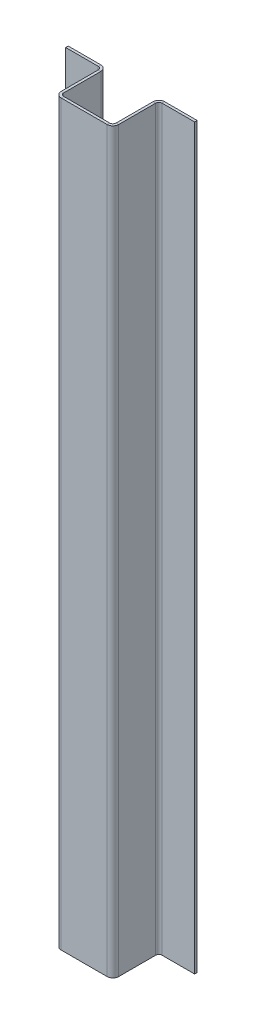
ISO-10303-21;
HEADER;
FILE_DESCRIPTION(('STEP AP214'),'2;1');
FILE_NAME('part.step','',(''),(''),'','','');
FILE_SCHEMA(('AUTOMOTIVE_DESIGN { 1 0 10303 214 1 1 1 1 }'));
ENDSEC;
DATA;
#1=APPLICATION_CONTEXT('core data for automotive mechanical design processes');
#2=APPLICATION_PROTOCOL_DEFINITION('international standard','automotive_design',2000,#1);
#3=PRODUCT_CONTEXT('',#1,'mechanical');
#4=PRODUCT('Part','Part','',(#3));
#5=PRODUCT_RELATED_PRODUCT_CATEGORY('part','',(#4));
#6=PRODUCT_DEFINITION_FORMATION('','',#4);
#7=PRODUCT_DEFINITION_CONTEXT('part definition',#1,'design');
#8=PRODUCT_DEFINITION('design','',#6,#7);
#9=PRODUCT_DEFINITION_SHAPE('','',#8);
#10=(LENGTH_UNIT() NAMED_UNIT(*) SI_UNIT(.MILLI.,.METRE.));
#11=(NAMED_UNIT(*) PLANE_ANGLE_UNIT() SI_UNIT($,.RADIAN.));
#12=(NAMED_UNIT(*) SI_UNIT($,.STERADIAN.) SOLID_ANGLE_UNIT());
#13=UNCERTAINTY_MEASURE_WITH_UNIT(LENGTH_MEASURE(1.E-05),#10,'distance_accuracy_value','');
#14=(GEOMETRIC_REPRESENTATION_CONTEXT(3) GLOBAL_UNCERTAINTY_ASSIGNED_CONTEXT((#13)) GLOBAL_UNIT_ASSIGNED_CONTEXT((#10,
#11,#12)) REPRESENTATION_CONTEXT('',''));
#15=CARTESIAN_POINT('',(0.,0.,0.));
#16=DIRECTION('',(0.,0.,1.));
#17=DIRECTION('',(1.,0.,0.));
#18=AXIS2_PLACEMENT_3D('',#15,#16,#17);
#19=CARTESIAN_POINT('',(22.5000000000006,-289.,-38.0000000000042));
#20=DIRECTION('',(0.,1.,0.));
#21=DIRECTION('',(0.,0.,1.));
#22=AXIS2_PLACEMENT_3D('',#19,#20,#21);
#23=PLANE('',#22);
#24=DIRECTION('',(-1.,0.,0.));
#25=VECTOR('',#24,1.);
#26=CARTESIAN_POINT('',(22.5000000000002,-289.000000000001,-33.5000000000021));
#27=LINE('',#26,#25);
#28=CARTESIAN_POINT('',(22.5000000000002,-289.000000000001,-33.5000000000021));
#29=VERTEX_POINT('',#28);
#30=CARTESIAN_POINT('',(20.5000000000009,-289.000000000001,-33.5000000000019));
#31=VERTEX_POINT('',#30);
#32=EDGE_CURVE('E325',#29,#31,#27,.T.);
#33=ORIENTED_EDGE('',*,*,#32,.F.);
#34=DIRECTION('',(0.,0.,-1.));
#35=VECTOR('',#34,1.);
#36=CARTESIAN_POINT('',(22.5000000000006,-289.,-3.5527136788005E-12));
#37=LINE('',#36,#35);
#38=CARTESIAN_POINT('',(22.5000000000011,-289.000000000002,-4.50000000000284));
#39=VERTEX_POINT('',#38);
#40=EDGE_CURVE('E427',#39,#29,#37,.T.);
#41=ORIENTED_EDGE('',*,*,#40,.F.);
#42=DIRECTION('',(-1.,0.,0.));
#43=VECTOR('',#42,1.);
#44=CARTESIAN_POINT('',(20.5,-289.000000000001,-4.50000000000039));
#45=LINE('',#44,#43);
#46=CARTESIAN_POINT('',(20.5,-289.000000000001,-4.50000000000039));
#47=VERTEX_POINT('',#46);
#48=EDGE_CURVE('E438',#47,#39,#45,.F.);
#49=ORIENTED_EDGE('',*,*,#48,.F.);
#50=DIRECTION('',(0.,0.,1.));
#51=VECTOR('',#50,1.);
#52=CARTESIAN_POINT('',(20.500000000001,-289.,-38.0000000000016));
#53=LINE('',#52,#51);
#54=EDGE_CURVE('E432',#47,#31,#53,.F.);
#55=ORIENTED_EDGE('',*,*,#54,.T.);
#56=EDGE_LOOP('',(#33,#41,#49,#55));
#57=FACE_BOUND('',#56,.T.);
#58=ADVANCED_FACE('F129',(#57),#23,.F.);
#59=CARTESIAN_POINT('',(22.4999999999997,289.000000000001,-1.99999999999978));
#60=DIRECTION('',(0.,-1.,0.));
#61=DIRECTION('',(0.,0.,-1.));
#62=AXIS2_PLACEMENT_3D('',#59,#60,#61);
#63=PLANE('',#62);
#64=DIRECTION('',(-1.,0.,0.));
#65=VECTOR('',#64,1.);
#66=CARTESIAN_POINT('',(22.5,289.,-33.4999999999996));
#67=LINE('',#66,#65);
#68=CARTESIAN_POINT('',(22.5,289.,-33.4999999999996));
#69=VERTEX_POINT('',#68);
#70=CARTESIAN_POINT('',(20.4999999999997,289.,-33.5000000000005));
#71=VERTEX_POINT('',#70);
#72=EDGE_CURVE('E314',#69,#71,#67,.T.);
#73=ORIENTED_EDGE('',*,*,#72,.T.);
#74=DIRECTION('',(0.,0.,-1.));
#75=VECTOR('',#74,1.);
#76=CARTESIAN_POINT('',(20.4999999999996,289.000000000002,-2.00000000000022));
#77=LINE('',#76,#75);
#78=CARTESIAN_POINT('',(20.5000000000006,289.,-4.50000000000017));
#79=VERTEX_POINT('',#78);
#80=EDGE_CURVE('E430',#71,#79,#77,.F.);
#81=ORIENTED_EDGE('',*,*,#80,.T.);
#82=DIRECTION('',(-1.,0.,0.));
#83=VECTOR('',#82,1.);
#84=CARTESIAN_POINT('',(22.5000000000002,289.,-4.50000000000039));
#85=LINE('',#84,#83);
#86=CARTESIAN_POINT('',(22.5000000000002,289.,-4.50000000000039));
#87=VERTEX_POINT('',#86);
#88=EDGE_CURVE('E421',#79,#87,#85,.F.);
#89=ORIENTED_EDGE('',*,*,#88,.T.);
#90=DIRECTION('',(0.,0.,1.));
#91=VECTOR('',#90,1.);
#92=CARTESIAN_POINT('',(22.5000000000001,289.000000000001,-2.22044604925031E-13));
#93=LINE('',#92,#91);
#94=EDGE_CURVE('E424',#69,#87,#93,.T.);
#95=ORIENTED_EDGE('',*,*,#94,.F.);
#96=EDGE_LOOP('',(#73,#81,#89,#95));
#97=FACE_BOUND('',#96,.T.);
#98=ADVANCED_FACE('F523',(#97),#63,.F.);
#99=CARTESIAN_POINT('',(22.5000000000005,-1.66533453693773E-13,-3.5527136788005E-12));
#100=DIRECTION('',(-1.,0.,0.));
#101=DIRECTION('',(0.,0.,1.));
#102=AXIS2_PLACEMENT_3D('',#99,#100,#101);
#103=PLANE('',#102);
#104=DIRECTION('',(0.,1.,0.));
#105=VECTOR('',#104,1.);
#106=CARTESIAN_POINT('',(22.5,289.,-33.4999999999996));
#107=LINE('',#106,#105);
#108=EDGE_CURVE('E320',#69,#29,#107,.F.);
#109=ORIENTED_EDGE('',*,*,#108,.F.);
#110=ORIENTED_EDGE('',*,*,#94,.T.);
#111=DIRECTION('',(0.,-1.,0.));
#112=VECTOR('',#111,1.);
#113=CARTESIAN_POINT('',(22.5000000000002,289.,-4.50000000000039));
#114=LINE('',#113,#112);
#115=EDGE_CURVE('E435',#39,#87,#114,.F.);
#116=ORIENTED_EDGE('',*,*,#115,.F.);
#117=ORIENTED_EDGE('',*,*,#40,.T.);
#118=EDGE_LOOP('',(#109,#110,#116,#117));
#119=FACE_BOUND('',#118,.T.);
#120=ADVANCED_FACE('F529',(#119),#103,.F.);
#121=CARTESIAN_POINT('',(20.5000000000009,-3.88578058618805E-13,-3.33066907387547E-12));
#122=DIRECTION('',(-1.,0.,0.));
#123=DIRECTION('',(0.,0.,1.));
#124=AXIS2_PLACEMENT_3D('',#121,#122,#123);
#125=PLANE('',#124);
#126=ORIENTED_EDGE('',*,*,#80,.F.);
#127=DIRECTION('',(0.,1.,0.));
#128=VECTOR('',#127,1.);
#129=CARTESIAN_POINT('',(20.4999999999997,289.,-33.5000000000005));
#130=LINE('',#129,#128);
#131=EDGE_CURVE('E309',#71,#31,#130,.F.);
#132=ORIENTED_EDGE('',*,*,#131,.T.);
#133=ORIENTED_EDGE('',*,*,#54,.F.);
#134=DIRECTION('',(0.,-1.,0.));
#135=VECTOR('',#134,1.);
#136=CARTESIAN_POINT('',(20.5000000000006,289.,-4.50000000000017));
#137=LINE('',#136,#135);
#138=EDGE_CURVE('E441',#79,#47,#137,.T.);
#139=ORIENTED_EDGE('',*,*,#138,.F.);
#140=EDGE_LOOP('',(#126,#132,#133,#139));
#141=FACE_BOUND('',#140,.T.);
#142=ADVANCED_FACE('F636',(#141),#125,.T.);
#143=CARTESIAN_POINT('',(-22.5000000000001,289.000000000002,-38.0000000000025));
#144=DIRECTION('',(0.,-1.,0.));
#145=DIRECTION('',(0.,0.,-1.));
#146=AXIS2_PLACEMENT_3D('',#143,#144,#145);
#147=PLANE('',#146);
#148=DIRECTION('',(1.,0.,0.));
#149=VECTOR('',#148,1.);
#150=CARTESIAN_POINT('',(-22.5000000000002,289.,-33.5000000000021));
#151=LINE('',#150,#149);
#152=CARTESIAN_POINT('',(-22.5000000000002,289.,-33.5000000000021));
#153=VERTEX_POINT('',#152);
#154=CARTESIAN_POINT('',(-20.5000000000001,289.,-33.5000000000027));
#155=VERTEX_POINT('',#154);
#156=EDGE_CURVE('E375',#153,#155,#151,.T.);
#157=ORIENTED_EDGE('',*,*,#156,.F.);
#158=DIRECTION('',(0.,0.,-1.));
#159=VECTOR('',#158,1.);
#160=CARTESIAN_POINT('',(-22.5000000000001,289.000000000001,-2.22044604925031E-13));
#161=LINE('',#160,#159);
#162=CARTESIAN_POINT('',(-22.4999999999997,289.,-4.50000000000261));
#163=VERTEX_POINT('',#162);
#164=EDGE_CURVE('E383',#163,#153,#161,.T.);
#165=ORIENTED_EDGE('',*,*,#164,.F.);
#166=DIRECTION('',(1.,0.,0.));
#167=VECTOR('',#166,1.);
#168=CARTESIAN_POINT('',(-20.4999999999997,289.,-4.50000000000172));
#169=LINE('',#168,#167);
#170=CARTESIAN_POINT('',(-20.4999999999997,289.,-4.50000000000172));
#171=VERTEX_POINT('',#170);
#172=EDGE_CURVE('E394',#171,#163,#169,.F.);
#173=ORIENTED_EDGE('',*,*,#172,.F.);
#174=DIRECTION('',(0.,0.,1.));
#175=VECTOR('',#174,1.);
#176=CARTESIAN_POINT('',(-20.5000000000001,289.000000000001,-38.0000000000027));
#177=LINE('',#176,#175);
#178=EDGE_CURVE('E388',#171,#155,#177,.F.);
#179=ORIENTED_EDGE('',*,*,#178,.T.);
#180=EDGE_LOOP('',(#157,#165,#173,#179));
#181=FACE_BOUND('',#180,.T.);
#182=ADVANCED_FACE('F503',(#181),#147,.F.);
#183=CARTESIAN_POINT('',(-22.499999999999,-289.,-2.000000000002));
#184=DIRECTION('',(0.,1.,0.));
#185=DIRECTION('',(0.,0.,1.));
#186=AXIS2_PLACEMENT_3D('',#183,#184,#185);
#187=PLANE('',#186);
#188=DIRECTION('',(1.,0.,0.));
#189=VECTOR('',#188,1.);
#190=CARTESIAN_POINT('',(-22.5000000000002,-289.000000000002,-33.5000000000032));
#191=LINE('',#190,#189);
#192=CARTESIAN_POINT('',(-22.5000000000002,-289.000000000002,-33.5000000000032));
#193=VERTEX_POINT('',#192);
#194=CARTESIAN_POINT('',(-20.4999999999996,-289.,-33.5000000000027));
#195=VERTEX_POINT('',#194);
#196=EDGE_CURVE('E365',#193,#195,#191,.T.);
#197=ORIENTED_EDGE('',*,*,#196,.T.);
#198=DIRECTION('',(0.,0.,-1.));
#199=VECTOR('',#198,1.);
#200=CARTESIAN_POINT('',(-20.4999999999996,-289.000000000001,-2.00000000000156));
#201=LINE('',#200,#199);
#202=CARTESIAN_POINT('',(-20.4999999999989,-289.000000000002,-4.50000000000106));
#203=VERTEX_POINT('',#202);
#204=EDGE_CURVE('E386',#195,#203,#201,.F.);
#205=ORIENTED_EDGE('',*,*,#204,.T.);
#206=DIRECTION('',(1.,0.,0.));
#207=VECTOR('',#206,1.);
#208=CARTESIAN_POINT('',(-22.4999999999995,-289.000000000001,-4.5000000000015));
#209=LINE('',#208,#207);
#210=CARTESIAN_POINT('',(-22.4999999999995,-289.000000000001,-4.5000000000015));
#211=VERTEX_POINT('',#210);
#212=EDGE_CURVE('E377',#203,#211,#209,.F.);
#213=ORIENTED_EDGE('',*,*,#212,.T.);
#214=DIRECTION('',(0.,0.,1.));
#215=VECTOR('',#214,1.);
#216=CARTESIAN_POINT('',(-22.4999999999995,-289.000000000001,-2.22044604925031E-12));
#217=LINE('',#216,#215);
#218=EDGE_CURVE('E380',#193,#211,#217,.T.);
#219=ORIENTED_EDGE('',*,*,#218,.F.);
#220=EDGE_LOOP('',(#197,#205,#213,#219));
#221=FACE_BOUND('',#220,.T.);
#222=ADVANCED_FACE('F620',(#221),#187,.F.);
#223=CARTESIAN_POINT('',(-22.4999999999996,-3.33066907387547E-13,-1.77635683940025E-12));
#224=DIRECTION('',(1.,0.,0.));
#225=DIRECTION('',(0.,0.,-1.));
#226=AXIS2_PLACEMENT_3D('',#223,#224,#225);
#227=PLANE('',#226);
#228=DIRECTION('',(0.,-1.,0.));
#229=VECTOR('',#228,1.);
#230=CARTESIAN_POINT('',(-22.5000000000002,-289.000000000002,-33.5000000000032));
#231=LINE('',#230,#229);
#232=EDGE_CURVE('E371',#193,#153,#231,.F.);
#233=ORIENTED_EDGE('',*,*,#232,.F.);
#234=ORIENTED_EDGE('',*,*,#218,.T.);
#235=DIRECTION('',(0.,1.,0.));
#236=VECTOR('',#235,1.);
#237=CARTESIAN_POINT('',(-22.4999999999995,-289.000000000001,-4.5000000000015));
#238=LINE('',#237,#236);
#239=EDGE_CURVE('E391',#163,#211,#238,.F.);
#240=ORIENTED_EDGE('',*,*,#239,.F.);
#241=ORIENTED_EDGE('',*,*,#164,.T.);
#242=EDGE_LOOP('',(#233,#234,#240,#241));
#243=FACE_BOUND('',#242,.T.);
#244=ADVANCED_FACE('F508',(#243),#227,.F.);
#245=CARTESIAN_POINT('',(-20.5,2.22044604925031E-13,0.));
#246=DIRECTION('',(1.,0.,0.));
#247=DIRECTION('',(0.,0.,-1.));
#248=AXIS2_PLACEMENT_3D('',#245,#246,#247);
#249=PLANE('',#248);
#250=ORIENTED_EDGE('',*,*,#204,.F.);
#251=DIRECTION('',(0.,-1.,0.));
#252=VECTOR('',#251,1.);
#253=CARTESIAN_POINT('',(-20.4999999999996,-289.,-33.5000000000027));
#254=LINE('',#253,#252);
#255=EDGE_CURVE('E360',#195,#155,#254,.F.);
#256=ORIENTED_EDGE('',*,*,#255,.T.);
#257=ORIENTED_EDGE('',*,*,#178,.F.);
#258=DIRECTION('',(0.,1.,0.));
#259=VECTOR('',#258,1.);
#260=CARTESIAN_POINT('',(-20.4999999999989,-289.000000000002,-4.50000000000106));
#261=LINE('',#260,#259);
#262=EDGE_CURVE('E397',#203,#171,#261,.T.);
#263=ORIENTED_EDGE('',*,*,#262,.F.);
#264=EDGE_LOOP('',(#250,#256,#257,#263));
#265=FACE_BOUND('',#264,.T.);
#266=ADVANCED_FACE('F500',(#265),#249,.T.);
#267=CARTESIAN_POINT('',(4.44089209850063E-13,3.88578058618805E-13,-2.));
#268=DIRECTION('',(0.,0.,1.));
#269=DIRECTION('',(1.,0.,0.));
#270=AXIS2_PLACEMENT_3D('',#267,#268,#269);
#271=PLANE('',#270);
#272=DIRECTION('',(0.,1.,0.));
#273=VECTOR('',#272,1.);
#274=CARTESIAN_POINT('',(-18.0000000000001,289.000000000002,-2.00000000000133));
#275=LINE('',#274,#273);
#276=CARTESIAN_POINT('',(-18.0000000000001,289.000000000002,-2.00000000000133));
#277=VERTEX_POINT('',#276);
#278=CARTESIAN_POINT('',(-18.0000000000001,-289.000000000001,-2.00000000000156));
#279=VERTEX_POINT('',#278);
#280=EDGE_CURVE('E414',#277,#279,#275,.F.);
#281=ORIENTED_EDGE('',*,*,#280,.F.);
#282=DIRECTION('',(-1.,0.,0.));
#283=VECTOR('',#282,1.);
#284=CARTESIAN_POINT('',(22.4999999999997,289.000000000001,-1.99999999999978));
#285=LINE('',#284,#283);
#286=CARTESIAN_POINT('',(18.0000000000005,289.000000000001,-2.00000000000067));
#287=VERTEX_POINT('',#286);
#288=EDGE_CURVE('E15',#287,#277,#285,.T.);
#289=ORIENTED_EDGE('',*,*,#288,.F.);
#290=DIRECTION('',(0.,-1.,0.));
#291=VECTOR('',#290,1.);
#292=CARTESIAN_POINT('',(18.0000000000003,-289.000000000001,-2.00000000000244));
#293=LINE('',#292,#291);
#294=CARTESIAN_POINT('',(18.0000000000003,-289.000000000001,-2.00000000000244));
#295=VERTEX_POINT('',#294);
#296=EDGE_CURVE('E458',#295,#287,#293,.F.);
#297=ORIENTED_EDGE('',*,*,#296,.F.);
#298=DIRECTION('',(1.,0.,0.));
#299=VECTOR('',#298,1.);
#300=CARTESIAN_POINT('',(22.4999999999996,-288.999999999999,-2.00000000000222));
#301=LINE('',#300,#299);
#302=EDGE_CURVE('E138',#279,#295,#301,.T.);
#303=ORIENTED_EDGE('',*,*,#302,.F.);
#304=EDGE_LOOP('',(#281,#289,#297,#303));
#305=FACE_BOUND('',#304,.T.);
#306=ADVANCED_FACE('F490',(#305),#271,.F.);
#307=CARTESIAN_POINT('',(0.,0.,0.));
#308=DIRECTION('',(0.,0.,1.));
#309=DIRECTION('',(1.,0.,0.));
#310=AXIS2_PLACEMENT_3D('',#307,#308,#309);
#311=PLANE('',#310);
#312=DIRECTION('',(-1.,0.,0.));
#313=VECTOR('',#312,1.);
#314=CARTESIAN_POINT('',(22.5000000000001,289.000000000001,-2.22044604925031E-13));
#315=LINE('',#314,#313);
#316=CARTESIAN_POINT('',(18.0000000000003,289.000000000001,-4.44089209850063E-13));
#317=VERTEX_POINT('',#316);
#318=CARTESIAN_POINT('',(-18.,289.,0.));
#319=VERTEX_POINT('',#318);
#320=EDGE_CURVE('E133',#317,#319,#315,.T.);
#321=ORIENTED_EDGE('',*,*,#320,.T.);
#322=DIRECTION('',(0.,1.,0.));
#323=VECTOR('',#322,1.);
#324=CARTESIAN_POINT('',(-18.,289.,0.));
#325=LINE('',#324,#323);
#326=CARTESIAN_POINT('',(-18.,-289.,0.));
#327=VERTEX_POINT('',#326);
#328=EDGE_CURVE('E401',#319,#327,#325,.F.);
#329=ORIENTED_EDGE('',*,*,#328,.T.);
#330=DIRECTION('',(1.,0.,0.));
#331=VECTOR('',#330,1.);
#332=CARTESIAN_POINT('',(22.5000000000002,-289.,-2.66453525910038E-12));
#333=LINE('',#332,#331);
#334=CARTESIAN_POINT('',(18.0000000000002,-289.000000000001,-3.10862446895044E-12));
#335=VERTEX_POINT('',#334);
#336=EDGE_CURVE('E465',#327,#335,#333,.T.);
#337=ORIENTED_EDGE('',*,*,#336,.T.);
#338=DIRECTION('',(0.,-1.,0.));
#339=VECTOR('',#338,1.);
#340=CARTESIAN_POINT('',(18.0000000000002,-289.000000000001,-3.10862446895044E-12));
#341=LINE('',#340,#339);
#342=EDGE_CURVE('E445',#335,#317,#341,.F.);
#343=ORIENTED_EDGE('',*,*,#342,.T.);
#344=EDGE_LOOP('',(#321,#329,#337,#343));
#345=FACE_BOUND('',#344,.T.);
#346=ADVANCED_FACE('F474',(#345),#311,.T.);
#347=CARTESIAN_POINT('',(22.4999999999997,289.000000000001,-1.99999999999978));
#348=DIRECTION('',(0.,1.,0.));
#349=DIRECTION('',(0.,0.,1.));
#350=AXIS2_PLACEMENT_3D('',#347,#348,#349);
#351=PLANE('',#350);
#352=ORIENTED_EDGE('',*,*,#288,.T.);
#353=DIRECTION('',(0.,0.,1.));
#354=VECTOR('',#353,1.);
#355=CARTESIAN_POINT('',(-18.0000000000001,289.000000000002,-2.00000000000133));
#356=LINE('',#355,#354);
#357=EDGE_CURVE('E408',#277,#319,#356,.T.);
#358=ORIENTED_EDGE('',*,*,#357,.T.);
#359=ORIENTED_EDGE('',*,*,#320,.F.);
#360=DIRECTION('',(0.,0.,1.));
#361=VECTOR('',#360,1.);
#362=CARTESIAN_POINT('',(18.0000000000005,289.000000000001,-2.00000000000067));
#363=LINE('',#362,#361);
#364=EDGE_CURVE('E462',#287,#317,#363,.T.);
#365=ORIENTED_EDGE('',*,*,#364,.F.);
#366=EDGE_LOOP('',(#352,#358,#359,#365));
#367=FACE_BOUND('',#366,.T.);
#368=ADVANCED_FACE('F477',(#367),#351,.T.);
#369=CARTESIAN_POINT('',(22.4999999999996,-288.999999999999,-2.00000000000222));
#370=DIRECTION('',(0.,-1.,0.));
#371=DIRECTION('',(0.,0.,-1.));
#372=AXIS2_PLACEMENT_3D('',#369,#370,#371);
#373=PLANE('',#372);
#374=DIRECTION('',(0.,0.,1.));
#375=VECTOR('',#374,1.);
#376=CARTESIAN_POINT('',(-18.0000000000001,-289.000000000001,-2.00000000000156));
#377=LINE('',#376,#375);
#378=EDGE_CURVE('E418',#279,#327,#377,.T.);
#379=ORIENTED_EDGE('',*,*,#378,.F.);
#380=ORIENTED_EDGE('',*,*,#302,.T.);
#381=DIRECTION('',(0.,0.,1.));
#382=VECTOR('',#381,1.);
#383=CARTESIAN_POINT('',(18.0000000000003,-289.000000000001,-2.00000000000244));
#384=LINE('',#383,#382);
#385=EDGE_CURVE('E452',#295,#335,#384,.T.);
#386=ORIENTED_EDGE('',*,*,#385,.T.);
#387=ORIENTED_EDGE('',*,*,#336,.F.);
#388=EDGE_LOOP('',(#379,#380,#386,#387));
#389=FACE_BOUND('',#388,.T.);
#390=ADVANCED_FACE('F131',(#389),#373,.T.);
#391=CARTESIAN_POINT('',(18.0000000000005,289.,-4.50000000000017));
#392=DIRECTION('',(0.,1.,0.));
#393=DIRECTION('',(0.,0.,1.));
#394=AXIS2_PLACEMENT_3D('',#391,#392,#393);
#395=PLANE('',#394);
#396=ORIENTED_EDGE('',*,*,#88,.F.);
#397=CARTESIAN_POINT('',(18.0000000000005,289.,-4.50000000000017));
#398=DIRECTION('',(0.,-1.,0.));
#399=DIRECTION('',(0.,0.,-1.));
#400=AXIS2_PLACEMENT_3D('',#397,#398,#399);
#401=CIRCLE('',#400,2.5);
#402=EDGE_CURVE('E455',#287,#79,#401,.F.);
#403=ORIENTED_EDGE('',*,*,#402,.F.);
#404=ORIENTED_EDGE('',*,*,#364,.T.);
#405=CARTESIAN_POINT('',(18.0000000000005,289.,-4.50000000000017));
#406=DIRECTION('',(0.,-1.,0.));
#407=DIRECTION('',(0.,0.,-1.));
#408=AXIS2_PLACEMENT_3D('',#405,#406,#407);
#409=CIRCLE('',#408,4.5);
#410=EDGE_CURVE('E448',#317,#87,#409,.F.);
#411=ORIENTED_EDGE('',*,*,#410,.T.);
#412=EDGE_LOOP('',(#396,#403,#404,#411));
#413=FACE_BOUND('',#412,.T.);
#414=ADVANCED_FACE('F544',(#413),#395,.T.);
#415=CARTESIAN_POINT('',(18.0000000000006,-289.000000000002,-4.50000000000239));
#416=DIRECTION('',(0.,1.,0.));
#417=DIRECTION('',(0.,0.,1.));
#418=AXIS2_PLACEMENT_3D('',#415,#416,#417);
#419=PLANE('',#418);
#420=CARTESIAN_POINT('',(18.0000000000006,-289.000000000002,-4.50000000000239));
#421=DIRECTION('',(0.,-1.,0.));
#422=DIRECTION('',(0.,0.,-1.));
#423=AXIS2_PLACEMENT_3D('',#420,#421,#422);
#424=CIRCLE('',#423,2.5);
#425=EDGE_CURVE('E426',#47,#295,#424,.T.);
#426=ORIENTED_EDGE('',*,*,#425,.F.);
#427=ORIENTED_EDGE('',*,*,#48,.T.);
#428=CARTESIAN_POINT('',(18.0000000000006,-289.000000000002,-4.50000000000239));
#429=DIRECTION('',(0.,-1.,0.));
#430=DIRECTION('',(0.,0.,-1.));
#431=AXIS2_PLACEMENT_3D('',#428,#429,#430);
#432=CIRCLE('',#431,4.5);
#433=EDGE_CURVE('E449',#39,#335,#432,.T.);
#434=ORIENTED_EDGE('',*,*,#433,.T.);
#435=ORIENTED_EDGE('',*,*,#385,.F.);
#436=EDGE_LOOP('',(#426,#427,#434,#435));
#437=FACE_BOUND('',#436,.T.);
#438=ADVANCED_FACE('F539',(#437),#419,.F.);
#439=CARTESIAN_POINT('',(18.0000000000006,-289.000000000002,-4.50000000000239));
#440=DIRECTION('',(0.,-1.,0.));
#441=DIRECTION('',(1.,0.,0.));
#442=AXIS2_PLACEMENT_3D('',#439,#440,#441);
#443=CYLINDRICAL_SURFACE('',#442,4.5);
#444=ORIENTED_EDGE('',*,*,#342,.F.);
#445=ORIENTED_EDGE('',*,*,#433,.F.);
#446=ORIENTED_EDGE('',*,*,#115,.T.);
#447=ORIENTED_EDGE('',*,*,#410,.F.);
#448=EDGE_LOOP('',(#444,#445,#446,#447));
#449=FACE_BOUND('',#448,.T.);
#450=ADVANCED_FACE('F535',(#449),#443,.T.);
#451=CARTESIAN_POINT('',(18.0000000000006,-289.000000000002,-4.50000000000239));
#452=DIRECTION('',(0.,-1.,0.));
#453=DIRECTION('',(1.,0.,0.));
#454=AXIS2_PLACEMENT_3D('',#451,#452,#453);
#455=CYLINDRICAL_SURFACE('',#454,2.5);
#456=ORIENTED_EDGE('',*,*,#296,.T.);
#457=ORIENTED_EDGE('',*,*,#402,.T.);
#458=ORIENTED_EDGE('',*,*,#138,.T.);
#459=ORIENTED_EDGE('',*,*,#425,.T.);
#460=EDGE_LOOP('',(#456,#457,#458,#459));
#461=FACE_BOUND('',#460,.T.);
#462=ADVANCED_FACE('F538',(#461),#455,.F.);
#463=CARTESIAN_POINT('',(-17.9999999999989,-289.000000000001,-4.5000000000015));
#464=DIRECTION('',(0.,-1.,0.));
#465=DIRECTION('',(0.,0.,-1.));
#466=AXIS2_PLACEMENT_3D('',#463,#464,#465);
#467=PLANE('',#466);
#468=ORIENTED_EDGE('',*,*,#212,.F.);
#469=CARTESIAN_POINT('',(-17.9999999999989,-289.000000000001,-4.5000000000015));
#470=DIRECTION('',(0.,1.,0.));
#471=DIRECTION('',(0.,0.,1.));
#472=AXIS2_PLACEMENT_3D('',#469,#470,#471);
#473=CIRCLE('',#472,2.5);
#474=EDGE_CURVE('E411',#279,#203,#473,.F.);
#475=ORIENTED_EDGE('',*,*,#474,.F.);
#476=ORIENTED_EDGE('',*,*,#378,.T.);
#477=CARTESIAN_POINT('',(-17.9999999999989,-289.000000000001,-4.5000000000015));
#478=DIRECTION('',(0.,1.,0.));
#479=DIRECTION('',(0.,0.,1.));
#480=AXIS2_PLACEMENT_3D('',#477,#478,#479);
#481=CIRCLE('',#480,4.5);
#482=EDGE_CURVE('E404',#327,#211,#481,.F.);
#483=ORIENTED_EDGE('',*,*,#482,.T.);
#484=EDGE_LOOP('',(#468,#475,#476,#483));
#485=FACE_BOUND('',#484,.T.);
#486=ADVANCED_FACE('F496',(#485),#467,.T.);
#487=CARTESIAN_POINT('',(-17.9999999999997,289.,-4.50000000000017));
#488=DIRECTION('',(0.,-1.,0.));
#489=DIRECTION('',(0.,0.,-1.));
#490=AXIS2_PLACEMENT_3D('',#487,#488,#489);
#491=PLANE('',#490);
#492=CARTESIAN_POINT('',(-17.9999999999997,289.,-4.50000000000017));
#493=DIRECTION('',(0.,1.,0.));
#494=DIRECTION('',(0.,0.,1.));
#495=AXIS2_PLACEMENT_3D('',#492,#493,#494);
#496=CIRCLE('',#495,2.5);
#497=EDGE_CURVE('E382',#171,#277,#496,.T.);
#498=ORIENTED_EDGE('',*,*,#497,.F.);
#499=ORIENTED_EDGE('',*,*,#172,.T.);
#500=CARTESIAN_POINT('',(-17.9999999999997,289.,-4.50000000000017));
#501=DIRECTION('',(0.,1.,0.));
#502=DIRECTION('',(0.,0.,1.));
#503=AXIS2_PLACEMENT_3D('',#500,#501,#502);
#504=CIRCLE('',#503,4.5);
#505=EDGE_CURVE('E405',#163,#319,#504,.T.);
#506=ORIENTED_EDGE('',*,*,#505,.T.);
#507=ORIENTED_EDGE('',*,*,#357,.F.);
#508=EDGE_LOOP('',(#498,#499,#506,#507));
#509=FACE_BOUND('',#508,.T.);
#510=ADVANCED_FACE('F481',(#509),#491,.F.);
#511=CARTESIAN_POINT('',(-17.9999999999997,289.,-4.50000000000017));
#512=DIRECTION('',(0.,1.,0.));
#513=DIRECTION('',(-1.,0.,0.));
#514=AXIS2_PLACEMENT_3D('',#511,#512,#513);
#515=CYLINDRICAL_SURFACE('',#514,4.5);
#516=ORIENTED_EDGE('',*,*,#328,.F.);
#517=ORIENTED_EDGE('',*,*,#505,.F.);
#518=ORIENTED_EDGE('',*,*,#239,.T.);
#519=ORIENTED_EDGE('',*,*,#482,.F.);
#520=EDGE_LOOP('',(#516,#517,#518,#519));
#521=FACE_BOUND('',#520,.T.);
#522=ADVANCED_FACE('F511',(#521),#515,.T.);
#523=CARTESIAN_POINT('',(-17.9999999999997,289.,-4.50000000000017));
#524=DIRECTION('',(0.,1.,0.));
#525=DIRECTION('',(-1.,0.,0.));
#526=AXIS2_PLACEMENT_3D('',#523,#524,#525);
#527=CYLINDRICAL_SURFACE('',#526,2.5);
#528=ORIENTED_EDGE('',*,*,#280,.T.);
#529=ORIENTED_EDGE('',*,*,#474,.T.);
#530=ORIENTED_EDGE('',*,*,#262,.T.);
#531=ORIENTED_EDGE('',*,*,#497,.T.);
#532=EDGE_LOOP('',(#528,#529,#530,#531));
#533=FACE_BOUND('',#532,.T.);
#534=ADVANCED_FACE('F485',(#533),#527,.F.);
#535=CARTESIAN_POINT('',(-24.9999999999998,289.,-33.5000000000005));
#536=DIRECTION('',(0.,1.,0.));
#537=DIRECTION('',(0.,0.,1.));
#538=AXIS2_PLACEMENT_3D('',#535,#536,#537);
#539=PLANE('',#538);
#540=DIRECTION('',(0.,0.,1.));
#541=VECTOR('',#540,1.);
#542=CARTESIAN_POINT('',(-25.0000000000002,289.000000000002,-38.0000000000007));
#543=LINE('',#542,#541);
#544=CARTESIAN_POINT('',(-25.0000000000007,289.000000000001,-36.0000000000023));
#545=VERTEX_POINT('',#544);
#546=CARTESIAN_POINT('',(-25.0000000000002,289.000000000002,-38.0000000000007));
#547=VERTEX_POINT('',#546);
#548=EDGE_CURVE('E327',#545,#547,#543,.F.);
#549=ORIENTED_EDGE('',*,*,#548,.F.);
#550=CARTESIAN_POINT('',(-24.9999999999998,289.,-33.5000000000005));
#551=DIRECTION('',(0.,-1.,0.));
#552=DIRECTION('',(0.,0.,-1.));
#553=AXIS2_PLACEMENT_3D('',#550,#551,#552);
#554=CIRCLE('',#553,2.50000000000001);
#555=EDGE_CURVE('E368',#153,#545,#554,.F.);
#556=ORIENTED_EDGE('',*,*,#555,.F.);
#557=ORIENTED_EDGE('',*,*,#156,.T.);
#558=CARTESIAN_POINT('',(-24.9999999999998,289.,-33.5000000000005));
#559=DIRECTION('',(0.,-1.,0.));
#560=DIRECTION('',(0.,0.,-1.));
#561=AXIS2_PLACEMENT_3D('',#558,#559,#560);
#562=CIRCLE('',#561,4.50000000000001);
#563=EDGE_CURVE('E154',#155,#547,#562,.F.);
#564=ORIENTED_EDGE('',*,*,#563,.T.);
#565=EDGE_LOOP('',(#549,#556,#557,#564));
#566=FACE_BOUND('',#565,.T.);
#567=ADVANCED_FACE('F518',(#566),#539,.T.);
#568=CARTESIAN_POINT('',(-24.9999999999997,-289.,-33.5000000000023));
#569=DIRECTION('',(0.,1.,0.));
#570=DIRECTION('',(0.,0.,1.));
#571=AXIS2_PLACEMENT_3D('',#568,#569,#570);
#572=PLANE('',#571);
#573=CARTESIAN_POINT('',(-24.9999999999997,-289.,-33.5000000000023));
#574=DIRECTION('',(0.,-1.,0.));
#575=DIRECTION('',(0.,0.,-1.));
#576=AXIS2_PLACEMENT_3D('',#573,#574,#575);
#577=CIRCLE('',#576,2.50000000000001);
#578=CARTESIAN_POINT('',(-24.9999999999998,-289.000000000001,-36.0000000000027));
#579=VERTEX_POINT('',#578);
#580=EDGE_CURVE('E333',#579,#193,#577,.T.);
#581=ORIENTED_EDGE('',*,*,#580,.F.);
#582=DIRECTION('',(0.,0.,1.));
#583=VECTOR('',#582,1.);
#584=CARTESIAN_POINT('',(-24.9999999999998,-289.000000000001,-36.0000000000027));
#585=LINE('',#584,#583);
#586=CARTESIAN_POINT('',(-24.9999999999992,-289.,-38.0000000000034));
#587=VERTEX_POINT('',#586);
#588=EDGE_CURVE('E353',#579,#587,#585,.F.);
#589=ORIENTED_EDGE('',*,*,#588,.T.);
#590=CARTESIAN_POINT('',(-24.9999999999997,-289.,-33.5000000000023));
#591=DIRECTION('',(0.,-1.,0.));
#592=DIRECTION('',(0.,0.,-1.));
#593=AXIS2_PLACEMENT_3D('',#590,#591,#592);
#594=CIRCLE('',#593,4.50000000000001);
#595=EDGE_CURVE('E363',#587,#195,#594,.T.);
#596=ORIENTED_EDGE('',*,*,#595,.T.);
#597=ORIENTED_EDGE('',*,*,#196,.F.);
#598=EDGE_LOOP('',(#581,#589,#596,#597));
#599=FACE_BOUND('',#598,.T.);
#600=ADVANCED_FACE('F666',(#599),#572,.F.);
#601=CARTESIAN_POINT('',(-24.9999999999997,-289.,-33.5000000000023));
#602=DIRECTION('',(0.,-1.,0.));
#603=DIRECTION('',(0.,0.,-1.));
#604=AXIS2_PLACEMENT_3D('',#601,#602,#603);
#605=CYLINDRICAL_SURFACE('',#604,4.50000000000001);
#606=ORIENTED_EDGE('',*,*,#255,.F.);
#607=ORIENTED_EDGE('',*,*,#595,.F.);
#608=DIRECTION('',(0.,-1.,0.));
#609=VECTOR('',#608,1.);
#610=CARTESIAN_POINT('',(-25.0000000000002,289.000000000002,-38.0000000000007));
#611=LINE('',#610,#609);
#612=EDGE_CURVE('E351',#587,#547,#611,.F.);
#613=ORIENTED_EDGE('',*,*,#612,.T.);
#614=ORIENTED_EDGE('',*,*,#563,.F.);
#615=EDGE_LOOP('',(#606,#607,#613,#614));
#616=FACE_BOUND('',#615,.T.);
#617=ADVANCED_FACE('F676',(#616),#605,.T.);
#618=CARTESIAN_POINT('',(-24.9999999999997,-289.,-33.5000000000023));
#619=DIRECTION('',(0.,-1.,0.));
#620=DIRECTION('',(0.,0.,-1.));
#621=AXIS2_PLACEMENT_3D('',#618,#619,#620);
#622=CYLINDRICAL_SURFACE('',#621,2.50000000000001);
#623=ORIENTED_EDGE('',*,*,#232,.T.);
#624=ORIENTED_EDGE('',*,*,#555,.T.);
#625=DIRECTION('',(0.,-1.,0.));
#626=VECTOR('',#625,1.);
#627=CARTESIAN_POINT('',(-25.0000000000007,289.000000000001,-36.0000000000023));
#628=LINE('',#627,#626);
#629=EDGE_CURVE('E356',#545,#579,#628,.T.);
#630=ORIENTED_EDGE('',*,*,#629,.T.);
#631=ORIENTED_EDGE('',*,*,#580,.T.);
#632=EDGE_LOOP('',(#623,#624,#630,#631));
#633=FACE_BOUND('',#632,.T.);
#634=ADVANCED_FACE('F686',(#633),#622,.F.);
#635=CARTESIAN_POINT('',(-50.4999999999998,-289.,-38.0000000000014));
#636=DIRECTION('',(0.,1.,0.));
#637=DIRECTION('',(0.,0.,1.));
#638=AXIS2_PLACEMENT_3D('',#635,#636,#637);
#639=PLANE('',#638);
#640=ORIENTED_EDGE('',*,*,#588,.F.);
#641=DIRECTION('',(1.,0.,0.));
#642=VECTOR('',#641,1.);
#643=CARTESIAN_POINT('',(-50.4999999999992,-289.000000000001,-36.0000000000023));
#644=LINE('',#643,#642);
#645=CARTESIAN_POINT('',(-50.4999999999992,-289.000000000001,-36.0000000000023));
#646=VERTEX_POINT('',#645);
#647=EDGE_CURVE('E349',#579,#646,#644,.F.);
#648=ORIENTED_EDGE('',*,*,#647,.T.);
#649=DIRECTION('',(0.,0.,1.));
#650=VECTOR('',#649,1.);
#651=CARTESIAN_POINT('',(-50.4999999999998,-289.,-38.0000000000014));
#652=LINE('',#651,#650);
#653=CARTESIAN_POINT('',(-50.4999999999998,-289.,-38.0000000000014));
#654=VERTEX_POINT('',#653);
#655=EDGE_CURVE('E330',#654,#646,#652,.T.);
#656=ORIENTED_EDGE('',*,*,#655,.F.);
#657=DIRECTION('',(-1.,0.,0.));
#658=VECTOR('',#657,1.);
#659=CARTESIAN_POINT('',(2.22044604925031E-13,-289.000000000001,-38.0000000000018));
#660=LINE('',#659,#658);
#661=EDGE_CURVE('E342',#587,#654,#660,.T.);
#662=ORIENTED_EDGE('',*,*,#661,.F.);
#663=EDGE_LOOP('',(#640,#648,#656,#662));
#664=FACE_BOUND('',#663,.T.);
#665=ADVANCED_FACE('F695',(#664),#639,.F.);
#666=CARTESIAN_POINT('',(-22.5000000000001,289.000000000002,-38.0000000000025));
#667=DIRECTION('',(0.,-1.,0.));
#668=DIRECTION('',(0.,0.,-1.));
#669=AXIS2_PLACEMENT_3D('',#666,#667,#668);
#670=PLANE('',#669);
#671=ORIENTED_EDGE('',*,*,#548,.T.);
#672=DIRECTION('',(1.,0.,0.));
#673=VECTOR('',#672,1.);
#674=CARTESIAN_POINT('',(2.22044604925031E-13,289.000000000002,-38.0000000000018));
#675=LINE('',#674,#673);
#676=CARTESIAN_POINT('',(-50.5000000000002,289.000000000001,-37.9999999999998));
#677=VERTEX_POINT('',#676);
#678=EDGE_CURVE('E337',#677,#547,#675,.T.);
#679=ORIENTED_EDGE('',*,*,#678,.F.);
#680=DIRECTION('',(0.,0.,1.));
#681=VECTOR('',#680,1.);
#682=CARTESIAN_POINT('',(-50.5000000000002,289.000000000001,-37.9999999999998));
#683=LINE('',#682,#681);
#684=CARTESIAN_POINT('',(-50.5000000000002,289.000000000001,-36.0000000000023));
#685=VERTEX_POINT('',#684);
#686=EDGE_CURVE('E334',#677,#685,#683,.T.);
#687=ORIENTED_EDGE('',*,*,#686,.T.);
#688=DIRECTION('',(-1.,0.,0.));
#689=VECTOR('',#688,1.);
#690=CARTESIAN_POINT('',(-22.5000000000002,289.000000000001,-36.0000000000003));
#691=LINE('',#690,#689);
#692=EDGE_CURVE('E344',#685,#545,#691,.F.);
#693=ORIENTED_EDGE('',*,*,#692,.T.);
#694=EDGE_LOOP('',(#671,#679,#687,#693));
#695=FACE_BOUND('',#694,.T.);
#696=ADVANCED_FACE('F705',(#695),#670,.F.);
#697=CARTESIAN_POINT('',(0.,-6.10622663543836E-13,-38.0000000000005));
#698=DIRECTION('',(0.,0.,1.));
#699=DIRECTION('',(1.,0.,0.));
#700=AXIS2_PLACEMENT_3D('',#697,#698,#699);
#701=PLANE('',#700);
#702=ORIENTED_EDGE('',*,*,#612,.F.);
#703=ORIENTED_EDGE('',*,*,#661,.T.);
#704=DIRECTION('',(0.,1.,0.));
#705=VECTOR('',#704,1.);
#706=CARTESIAN_POINT('',(-50.4999999999994,-4.44089209850063E-13,-38.000000000002));
#707=LINE('',#706,#705);
#708=EDGE_CURVE('E340',#654,#677,#707,.T.);
#709=ORIENTED_EDGE('',*,*,#708,.T.);
#710=ORIENTED_EDGE('',*,*,#678,.T.);
#711=EDGE_LOOP('',(#702,#703,#709,#710));
#712=FACE_BOUND('',#711,.T.);
#713=ADVANCED_FACE('F715',(#712),#701,.F.);
#714=CARTESIAN_POINT('',(4.9960036108132E-13,-6.10622663543836E-13,-36.0000000000023));
#715=DIRECTION('',(0.,0.,1.));
#716=DIRECTION('',(1.,0.,0.));
#717=AXIS2_PLACEMENT_3D('',#714,#715,#716);
#718=PLANE('',#717);
#719=ORIENTED_EDGE('',*,*,#647,.F.);
#720=ORIENTED_EDGE('',*,*,#629,.F.);
#721=ORIENTED_EDGE('',*,*,#692,.F.);
#722=DIRECTION('',(0.,-1.,0.));
#723=VECTOR('',#722,1.);
#724=CARTESIAN_POINT('',(-50.5000000000002,289.000000000001,-36.0000000000023));
#725=LINE('',#724,#723);
#726=EDGE_CURVE('E347',#646,#685,#725,.F.);
#727=ORIENTED_EDGE('',*,*,#726,.F.);
#728=EDGE_LOOP('',(#719,#720,#721,#727));
#729=FACE_BOUND('',#728,.T.);
#730=ADVANCED_FACE('F725',(#729),#718,.T.);
#731=CARTESIAN_POINT('',(-50.5000000000002,289.000000000001,-37.9999999999998));
#732=DIRECTION('',(1.,0.,0.));
#733=DIRECTION('',(0.,0.,-1.));
#734=AXIS2_PLACEMENT_3D('',#731,#732,#733);
#735=PLANE('',#734);
#736=ORIENTED_EDGE('',*,*,#726,.T.);
#737=ORIENTED_EDGE('',*,*,#686,.F.);
#738=ORIENTED_EDGE('',*,*,#708,.F.);
#739=ORIENTED_EDGE('',*,*,#655,.T.);
#740=EDGE_LOOP('',(#736,#737,#738,#739));
#741=FACE_BOUND('',#740,.T.);
#742=ADVANCED_FACE('F735',(#741),#735,.F.);
#743=CARTESIAN_POINT('',(25.0000000000001,-289.000000000001,-33.5000000000025));
#744=DIRECTION('',(0.,-1.,0.));
#745=DIRECTION('',(0.,0.,-1.));
#746=AXIS2_PLACEMENT_3D('',#743,#744,#745);
#747=PLANE('',#746);
#748=DIRECTION('',(0.,0.,1.));
#749=VECTOR('',#748,1.);
#750=CARTESIAN_POINT('',(25.000000000001,-289.000000000001,-38.0000000000031));
#751=LINE('',#750,#749);
#752=CARTESIAN_POINT('',(25.000000000001,-289.,-36.0000000000027));
#753=VERTEX_POINT('',#752);
#754=CARTESIAN_POINT('',(25.000000000001,-289.000000000001,-38.0000000000031));
#755=VERTEX_POINT('',#754);
#756=EDGE_CURVE('E292',#753,#755,#751,.F.);
#757=ORIENTED_EDGE('',*,*,#756,.F.);
#758=CARTESIAN_POINT('',(25.0000000000001,-289.000000000001,-33.5000000000025));
#759=DIRECTION('',(0.,1.,0.));
#760=DIRECTION('',(0.,0.,1.));
#761=AXIS2_PLACEMENT_3D('',#758,#759,#760);
#762=CIRCLE('',#761,2.50000000000001);
#763=EDGE_CURVE('E317',#29,#753,#762,.F.);
#764=ORIENTED_EDGE('',*,*,#763,.F.);
#765=ORIENTED_EDGE('',*,*,#32,.T.);
#766=CARTESIAN_POINT('',(25.0000000000001,-289.000000000001,-33.5000000000025));
#767=DIRECTION('',(0.,1.,0.));
#768=DIRECTION('',(0.,0.,1.));
#769=AXIS2_PLACEMENT_3D('',#766,#767,#768);
#770=CIRCLE('',#769,4.50000000000001);
#771=EDGE_CURVE('E146',#31,#755,#770,.F.);
#772=ORIENTED_EDGE('',*,*,#771,.T.);
#773=EDGE_LOOP('',(#757,#764,#765,#772));
#774=FACE_BOUND('',#773,.T.);
#775=ADVANCED_FACE('F745',(#774),#747,.T.);
#776=CARTESIAN_POINT('',(24.9999999999999,289.,-33.5000000000005));
#777=DIRECTION('',(0.,-1.,0.));
#778=DIRECTION('',(0.,0.,-1.));
#779=AXIS2_PLACEMENT_3D('',#776,#777,#778);
#780=PLANE('',#779);
#781=CARTESIAN_POINT('',(24.9999999999999,289.,-33.5000000000005));
#782=DIRECTION('',(0.,1.,0.));
#783=DIRECTION('',(0.,0.,1.));
#784=AXIS2_PLACEMENT_3D('',#781,#782,#783);
#785=CIRCLE('',#784,2.50000000000001);
#786=CARTESIAN_POINT('',(25.0000000000006,289.000000000002,-36.0000000000007));
#787=VERTEX_POINT('',#786);
#788=EDGE_CURVE('E322',#787,#69,#785,.T.);
#789=ORIENTED_EDGE('',*,*,#788,.F.);
#790=DIRECTION('',(0.,0.,1.));
#791=VECTOR('',#790,1.);
#792=CARTESIAN_POINT('',(25.0000000000006,289.000000000002,-36.0000000000007));
#793=LINE('',#792,#791);
#794=CARTESIAN_POINT('',(25.0000000000001,289.000000000001,-38.0000000000009));
#795=VERTEX_POINT('',#794);
#796=EDGE_CURVE('E303',#787,#795,#793,.F.);
#797=ORIENTED_EDGE('',*,*,#796,.T.);
#798=CARTESIAN_POINT('',(24.9999999999999,289.,-33.5000000000005));
#799=DIRECTION('',(0.,1.,0.));
#800=DIRECTION('',(0.,0.,1.));
#801=AXIS2_PLACEMENT_3D('',#798,#799,#800);
#802=CIRCLE('',#801,4.50000000000001);
#803=EDGE_CURVE('E312',#795,#71,#802,.T.);
#804=ORIENTED_EDGE('',*,*,#803,.T.);
#805=ORIENTED_EDGE('',*,*,#72,.F.);
#806=EDGE_LOOP('',(#789,#797,#804,#805));
#807=FACE_BOUND('',#806,.T.);
#808=ADVANCED_FACE('F755',(#807),#780,.F.);
#809=CARTESIAN_POINT('',(24.9999999999999,289.,-33.5000000000005));
#810=DIRECTION('',(0.,1.,0.));
#811=DIRECTION('',(0.,0.,-1.));
#812=AXIS2_PLACEMENT_3D('',#809,#810,#811);
#813=CYLINDRICAL_SURFACE('',#812,4.50000000000001);
#814=ORIENTED_EDGE('',*,*,#131,.F.);
#815=ORIENTED_EDGE('',*,*,#803,.F.);
#816=DIRECTION('',(0.,1.,0.));
#817=VECTOR('',#816,1.);
#818=CARTESIAN_POINT('',(25.000000000001,-289.000000000001,-38.0000000000031));
#819=LINE('',#818,#817);
#820=EDGE_CURVE('E301',#795,#755,#819,.F.);
#821=ORIENTED_EDGE('',*,*,#820,.T.);
#822=ORIENTED_EDGE('',*,*,#771,.F.);
#823=EDGE_LOOP('',(#814,#815,#821,#822));
#824=FACE_BOUND('',#823,.T.);
#825=ADVANCED_FACE('F765',(#824),#813,.T.);
#826=CARTESIAN_POINT('',(24.9999999999999,289.,-33.5000000000005));
#827=DIRECTION('',(0.,1.,0.));
#828=DIRECTION('',(0.,0.,-1.));
#829=AXIS2_PLACEMENT_3D('',#826,#827,#828);
#830=CYLINDRICAL_SURFACE('',#829,2.50000000000001);
#831=ORIENTED_EDGE('',*,*,#108,.T.);
#832=ORIENTED_EDGE('',*,*,#763,.T.);
#833=DIRECTION('',(0.,1.,0.));
#834=VECTOR('',#833,1.);
#835=CARTESIAN_POINT('',(25.000000000001,-289.,-36.0000000000027));
#836=LINE('',#835,#834);
#837=EDGE_CURVE('E306',#753,#787,#836,.T.);
#838=ORIENTED_EDGE('',*,*,#837,.T.);
#839=ORIENTED_EDGE('',*,*,#788,.T.);
#840=EDGE_LOOP('',(#831,#832,#838,#839));
#841=FACE_BOUND('',#840,.T.);
#842=ADVANCED_FACE('F775',(#841),#830,.F.);
#843=CARTESIAN_POINT('',(22.5000000000006,-289.,-38.0000000000042));
#844=DIRECTION('',(0.,1.,0.));
#845=DIRECTION('',(0.,0.,1.));
#846=AXIS2_PLACEMENT_3D('',#843,#844,#845);
#847=PLANE('',#846);
#848=ORIENTED_EDGE('',*,*,#756,.T.);
#849=DIRECTION('',(-1.,0.,0.));
#850=VECTOR('',#849,1.);
#851=CARTESIAN_POINT('',(2.22044604925031E-13,-289.000000000001,-38.0000000000018));
#852=LINE('',#851,#850);
#853=CARTESIAN_POINT('',(50.5000000000002,-289.,-38.0000000000005));
#854=VERTEX_POINT('',#853);
#855=EDGE_CURVE('E273',#854,#755,#852,.T.);
#856=ORIENTED_EDGE('',*,*,#855,.F.);
#857=DIRECTION('',(0.,0.,1.));
#858=VECTOR('',#857,1.);
#859=CARTESIAN_POINT('',(50.5000000000002,-289.,-38.0000000000005));
#860=LINE('',#859,#858);
#861=CARTESIAN_POINT('',(50.5000000000008,-289.,-36.0000000000014));
#862=VERTEX_POINT('',#861);
#863=EDGE_CURVE('E279',#854,#862,#860,.T.);
#864=ORIENTED_EDGE('',*,*,#863,.T.);
#865=DIRECTION('',(1.,0.,0.));
#866=VECTOR('',#865,1.);
#867=CARTESIAN_POINT('',(22.5000000000001,-289.,-36.0000000000027));
#868=LINE('',#867,#866);
#869=EDGE_CURVE('E299',#862,#753,#868,.F.);
#870=ORIENTED_EDGE('',*,*,#869,.T.);
#871=EDGE_LOOP('',(#848,#856,#864,#870));
#872=FACE_BOUND('',#871,.T.);
#873=ADVANCED_FACE('F291',(#872),#847,.F.);
#874=CARTESIAN_POINT('',(50.500000000001,289.,-38.0000000000009));
#875=DIRECTION('',(0.,-1.,0.));
#876=DIRECTION('',(0.,0.,-1.));
#877=AXIS2_PLACEMENT_3D('',#874,#875,#876);
#878=PLANE('',#877);
#879=ORIENTED_EDGE('',*,*,#796,.F.);
#880=DIRECTION('',(-1.,0.,0.));
#881=VECTOR('',#880,1.);
#882=CARTESIAN_POINT('',(50.5000000000012,289.000000000002,-36.0000000000023));
#883=LINE('',#882,#881);
#884=CARTESIAN_POINT('',(50.5000000000012,289.000000000002,-36.0000000000023));
#885=VERTEX_POINT('',#884);
#886=EDGE_CURVE('E295',#787,#885,#883,.F.);
#887=ORIENTED_EDGE('',*,*,#886,.T.);
#888=DIRECTION('',(0.,0.,1.));
#889=VECTOR('',#888,1.);
#890=CARTESIAN_POINT('',(50.500000000001,289.,-38.0000000000009));
#891=LINE('',#890,#889);
#892=CARTESIAN_POINT('',(50.500000000001,289.,-38.0000000000009));
#893=VERTEX_POINT('',#892);
#894=EDGE_CURVE('E288',#893,#885,#891,.T.);
#895=ORIENTED_EDGE('',*,*,#894,.F.);
#896=DIRECTION('',(1.,0.,0.));
#897=VECTOR('',#896,1.);
#898=CARTESIAN_POINT('',(2.22044604925031E-13,289.000000000002,-38.0000000000018));
#899=LINE('',#898,#897);
#900=EDGE_CURVE('E275',#795,#893,#899,.T.);
#901=ORIENTED_EDGE('',*,*,#900,.F.);
#902=EDGE_LOOP('',(#879,#887,#895,#901));
#903=FACE_BOUND('',#902,.T.);
#904=ADVANCED_FACE('F793',(#903),#878,.F.);
#905=CARTESIAN_POINT('',(0.,-6.10622663543836E-13,-38.0000000000005));
#906=DIRECTION('',(0.,0.,1.));
#907=DIRECTION('',(1.,0.,0.));
#908=AXIS2_PLACEMENT_3D('',#905,#906,#907);
#909=PLANE('',#908);
#910=ORIENTED_EDGE('',*,*,#820,.F.);
#911=ORIENTED_EDGE('',*,*,#900,.T.);
#912=DIRECTION('',(0.,-1.,0.));
#913=VECTOR('',#912,1.);
#914=CARTESIAN_POINT('',(50.5000000000016,-1.11022302462516E-13,-38.0000000000025));
#915=LINE('',#914,#913);
#916=EDGE_CURVE('E268',#893,#854,#915,.T.);
#917=ORIENTED_EDGE('',*,*,#916,.T.);
#918=ORIENTED_EDGE('',*,*,#855,.T.);
#919=EDGE_LOOP('',(#910,#911,#917,#918));
#920=FACE_BOUND('',#919,.T.);
#921=ADVANCED_FACE('F271',(#920),#909,.F.);
#922=CARTESIAN_POINT('',(4.9960036108132E-13,-6.10622663543836E-13,-36.0000000000023));
#923=DIRECTION('',(0.,0.,1.));
#924=DIRECTION('',(1.,0.,0.));
#925=AXIS2_PLACEMENT_3D('',#922,#923,#924);
#926=PLANE('',#925);
#927=ORIENTED_EDGE('',*,*,#886,.F.);
#928=ORIENTED_EDGE('',*,*,#837,.F.);
#929=ORIENTED_EDGE('',*,*,#869,.F.);
#930=DIRECTION('',(0.,1.,0.));
#931=VECTOR('',#930,1.);
#932=CARTESIAN_POINT('',(50.5000000000008,-289.,-36.0000000000014));
#933=LINE('',#932,#931);
#934=EDGE_CURVE('E284',#885,#862,#933,.F.);
#935=ORIENTED_EDGE('',*,*,#934,.F.);
#936=EDGE_LOOP('',(#927,#928,#929,#935));
#937=FACE_BOUND('',#936,.T.);
#938=ADVANCED_FACE('F811',(#937),#926,.T.);
#939=CARTESIAN_POINT('',(50.5000000000002,-289.,-38.0000000000005));
#940=DIRECTION('',(-1.,0.,0.));
#941=DIRECTION('',(0.,0.,1.));
#942=AXIS2_PLACEMENT_3D('',#939,#940,#941);
#943=PLANE('',#942);
#944=ORIENTED_EDGE('',*,*,#934,.T.);
#945=ORIENTED_EDGE('',*,*,#863,.F.);
#946=ORIENTED_EDGE('',*,*,#916,.F.);
#947=ORIENTED_EDGE('',*,*,#894,.T.);
#948=EDGE_LOOP('',(#944,#945,#946,#947));
#949=FACE_BOUND('',#948,.T.);
#950=ADVANCED_FACE('F282',(#949),#943,.F.);
#951=CLOSED_SHELL('',(#58,#98,#120,#142,#182,#222,#244,#266,#306,#346,#368,#390,#414,#438,#450,
#462,#486,#510,#522,#534,#567,#600,#617,#634,#665,#696,#713,#730,#742,#775,#808,#825,#842,#873,
#904,#921,#938,#950));
#952=MANIFOLD_SOLID_BREP('B2',#951);
#953=ADVANCED_BREP_SHAPE_REPRESENTATION('',(#18,#952),#14);
#954=SHAPE_DEFINITION_REPRESENTATION(#9,#953);
ENDSEC;
END-ISO-10303-21;
